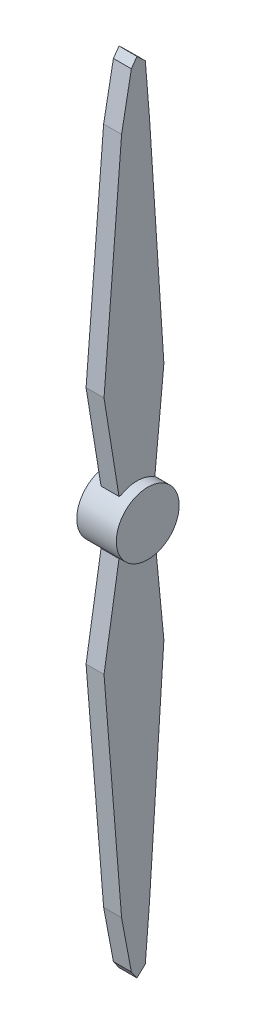
ISO-10303-21;
HEADER;
FILE_DESCRIPTION(('STEP AP214'),'2;1');
FILE_NAME('part.step','',(''),(''),'','','');
FILE_SCHEMA(('AUTOMOTIVE_DESIGN { 1 0 10303 214 1 1 1 1 }'));
ENDSEC;
DATA;
#1=APPLICATION_CONTEXT('core data for automotive mechanical design processes');
#2=APPLICATION_PROTOCOL_DEFINITION('international standard','automotive_design',2000,#1);
#3=PRODUCT_CONTEXT('',#1,'mechanical');
#4=PRODUCT('Part','Part','',(#3));
#5=PRODUCT_RELATED_PRODUCT_CATEGORY('part','',(#4));
#6=PRODUCT_DEFINITION_FORMATION('','',#4);
#7=PRODUCT_DEFINITION_CONTEXT('part definition',#1,'design');
#8=PRODUCT_DEFINITION('design','',#6,#7);
#9=PRODUCT_DEFINITION_SHAPE('','',#8);
#10=(LENGTH_UNIT() NAMED_UNIT(*) SI_UNIT(.MILLI.,.METRE.));
#11=(NAMED_UNIT(*) PLANE_ANGLE_UNIT() SI_UNIT($,.RADIAN.));
#12=(NAMED_UNIT(*) SI_UNIT($,.STERADIAN.) SOLID_ANGLE_UNIT());
#13=UNCERTAINTY_MEASURE_WITH_UNIT(LENGTH_MEASURE(1.E-05),#10,'distance_accuracy_value','');
#14=(GEOMETRIC_REPRESENTATION_CONTEXT(3) GLOBAL_UNCERTAINTY_ASSIGNED_CONTEXT((#13)) GLOBAL_UNIT_ASSIGNED_CONTEXT((#10,
#11,#12)) REPRESENTATION_CONTEXT('',''));
#15=CARTESIAN_POINT('',(0.,0.,0.));
#16=DIRECTION('',(0.,0.,1.));
#17=DIRECTION('',(1.,0.,0.));
#18=AXIS2_PLACEMENT_3D('',#15,#16,#17);
#19=CARTESIAN_POINT('',(8.8,0.,0.));
#20=DIRECTION('',(-1.,0.,0.));
#21=DIRECTION('',(0.,0.,1.));
#22=AXIS2_PLACEMENT_3D('',#19,#20,#21);
#23=CYLINDRICAL_SURFACE('',#22,14.);
#24=CARTESIAN_POINT('',(-8.8,0.,0.));
#25=DIRECTION('',(1.,0.,0.));
#26=DIRECTION('',(0.,0.,-1.));
#27=AXIS2_PLACEMENT_3D('',#24,#25,#26);
#28=CIRCLE('',#27,14.);
#29=CARTESIAN_POINT('',(-8.8,0.,-14.));
#30=VERTEX_POINT('',#29);
#31=EDGE_CURVE('E213',#30,#30,#28,.T.);
#32=ORIENTED_EDGE('',*,*,#31,.T.);
#33=EDGE_LOOP('',(#32));
#34=FACE_BOUND('',#33,.T.);
#35=CARTESIAN_POINT('',(8.8,0.,0.));
#36=DIRECTION('',(1.,0.,0.));
#37=DIRECTION('',(0.,0.,-1.));
#38=AXIS2_PLACEMENT_3D('',#35,#36,#37);
#39=CIRCLE('',#38,14.);
#40=CARTESIAN_POINT('',(8.8,0.,-14.));
#41=VERTEX_POINT('',#40);
#42=EDGE_CURVE('E216',#41,#41,#39,.T.);
#43=ORIENTED_EDGE('',*,*,#42,.F.);
#44=EDGE_LOOP('',(#43));
#45=FACE_BOUND('',#44,.T.);
#46=CARTESIAN_POINT('',(4.,0.,0.));
#47=DIRECTION('',(1.,0.,0.));
#48=DIRECTION('',(0.,0.,-1.));
#49=AXIS2_PLACEMENT_3D('',#46,#47,#48);
#50=CIRCLE('',#49,14.);
#51=CARTESIAN_POINT('',(4.,12.,7.21110255092798));
#52=VERTEX_POINT('',#51);
#53=CARTESIAN_POINT('',(4.,12.,-7.21110255092798));
#54=VERTEX_POINT('',#53);
#55=EDGE_CURVE('E62',#52,#54,#50,.F.);
#56=ORIENTED_EDGE('',*,*,#55,.F.);
#57=DIRECTION('',(-1.,0.,0.));
#58=VECTOR('',#57,1.);
#59=CARTESIAN_POINT('',(8.8,12.,7.21110255092798));
#60=LINE('',#59,#58);
#61=CARTESIAN_POINT('',(-4.,12.,7.21110255092798));
#62=VERTEX_POINT('',#61);
#63=EDGE_CURVE('E240',#52,#62,#60,.T.);
#64=ORIENTED_EDGE('',*,*,#63,.T.);
#65=CARTESIAN_POINT('',(-4.,0.,0.));
#66=DIRECTION('',(1.,0.,0.));
#67=DIRECTION('',(0.,0.,-1.));
#68=AXIS2_PLACEMENT_3D('',#65,#66,#67);
#69=CIRCLE('',#68,14.);
#70=CARTESIAN_POINT('',(-4.,12.,-7.21110255092798));
#71=VERTEX_POINT('',#70);
#72=EDGE_CURVE('E314',#62,#71,#69,.F.);
#73=ORIENTED_EDGE('',*,*,#72,.T.);
#74=DIRECTION('',(-1.,0.,0.));
#75=VECTOR('',#74,1.);
#76=CARTESIAN_POINT('',(8.8,12.,-7.21110255092798));
#77=LINE('',#76,#75);
#78=EDGE_CURVE('E244',#71,#54,#77,.F.);
#79=ORIENTED_EDGE('',*,*,#78,.T.);
#80=EDGE_LOOP('',(#56,#64,#73,#79));
#81=FACE_BOUND('',#80,.T.);
#82=CARTESIAN_POINT('',(4.,0.,0.));
#83=DIRECTION('',(-1.,0.,0.));
#84=DIRECTION('',(0.,0.,1.));
#85=AXIS2_PLACEMENT_3D('',#82,#83,#84);
#86=CIRCLE('',#85,14.);
#87=CARTESIAN_POINT('',(4.,-12.,-7.21110255092798));
#88=VERTEX_POINT('',#87);
#89=CARTESIAN_POINT('',(4.,-12.,7.21110255092798));
#90=VERTEX_POINT('',#89);
#91=EDGE_CURVE('E11',#88,#90,#86,.T.);
#92=ORIENTED_EDGE('',*,*,#91,.F.);
#93=DIRECTION('',(-1.,0.,0.));
#94=VECTOR('',#93,1.);
#95=CARTESIAN_POINT('',(8.8,-12.,-7.21110255092798));
#96=LINE('',#95,#94);
#97=CARTESIAN_POINT('',(-4.,-12.,-7.21110255092798));
#98=VERTEX_POINT('',#97);
#99=EDGE_CURVE('E318',#98,#88,#96,.F.);
#100=ORIENTED_EDGE('',*,*,#99,.F.);
#101=CARTESIAN_POINT('',(-4.,0.,0.));
#102=DIRECTION('',(-1.,0.,0.));
#103=DIRECTION('',(0.,0.,1.));
#104=AXIS2_PLACEMENT_3D('',#101,#102,#103);
#105=CIRCLE('',#104,14.);
#106=CARTESIAN_POINT('',(-4.,-12.,7.21110255092798));
#107=VERTEX_POINT('',#106);
#108=EDGE_CURVE('E212',#98,#107,#105,.T.);
#109=ORIENTED_EDGE('',*,*,#108,.T.);
#110=DIRECTION('',(-1.,0.,0.));
#111=VECTOR('',#110,1.);
#112=CARTESIAN_POINT('',(8.8,-12.,7.21110255092798));
#113=LINE('',#112,#111);
#114=EDGE_CURVE('E47',#90,#107,#113,.T.);
#115=ORIENTED_EDGE('',*,*,#114,.F.);
#116=EDGE_LOOP('',(#92,#100,#109,#115));
#117=FACE_BOUND('',#116,.T.);
#118=ADVANCED_FACE('F39',(#34,#45,#81,#117),#23,.T.);
#119=CARTESIAN_POINT('',(4.,12.,-8.001));
#120=DIRECTION('',(0.,1.,0.));
#121=DIRECTION('',(0.,0.,1.));
#122=AXIS2_PLACEMENT_3D('',#119,#120,#121);
#123=PLANE('',#122);
#124=ORIENTED_EDGE('',*,*,#78,.F.);
#125=DIRECTION('',(0.,0.,-1.));
#126=VECTOR('',#125,1.);
#127=CARTESIAN_POINT('',(-4.,12.,-8.001));
#128=LINE('',#127,#126);
#129=CARTESIAN_POINT('',(-4.,12.,-8.001));
#130=VERTEX_POINT('',#129);
#131=EDGE_CURVE('E248',#71,#130,#128,.T.);
#132=ORIENTED_EDGE('',*,*,#131,.T.);
#133=DIRECTION('',(-1.,0.,0.));
#134=VECTOR('',#133,1.);
#135=CARTESIAN_POINT('',(4.,12.,-8.001));
#136=LINE('',#135,#134);
#137=CARTESIAN_POINT('',(4.,12.,-8.001));
#138=VERTEX_POINT('',#137);
#139=EDGE_CURVE('E311',#138,#130,#136,.T.);
#140=ORIENTED_EDGE('',*,*,#139,.F.);
#141=DIRECTION('',(0.,0.,-1.));
#142=VECTOR('',#141,1.);
#143=CARTESIAN_POINT('',(4.,12.,-8.001));
#144=LINE('',#143,#142);
#145=EDGE_CURVE('E252',#54,#138,#144,.T.);
#146=ORIENTED_EDGE('',*,*,#145,.F.);
#147=EDGE_LOOP('',(#124,#132,#140,#146));
#148=FACE_BOUND('',#147,.T.);
#149=ADVANCED_FACE('F41',(#148),#123,.F.);
#150=ORIENTED_EDGE('',*,*,#63,.F.);
#151=CARTESIAN_POINT('',(4.,12.,8.001));
#152=VERTEX_POINT('',#151);
#153=EDGE_CURVE('E249',#152,#52,#144,.T.);
#154=ORIENTED_EDGE('',*,*,#153,.F.);
#155=DIRECTION('',(-1.,0.,0.));
#156=VECTOR('',#155,1.);
#157=CARTESIAN_POINT('',(4.,12.,8.001));
#158=LINE('',#157,#156);
#159=CARTESIAN_POINT('',(-4.,12.,8.001));
#160=VERTEX_POINT('',#159);
#161=EDGE_CURVE('E268',#152,#160,#158,.T.);
#162=ORIENTED_EDGE('',*,*,#161,.T.);
#163=EDGE_CURVE('E269',#160,#62,#128,.T.);
#164=ORIENTED_EDGE('',*,*,#163,.T.);
#165=EDGE_LOOP('',(#150,#154,#162,#164));
#166=FACE_BOUND('',#165,.T.);
#167=ADVANCED_FACE('F407',(#166),#123,.F.);
#168=CARTESIAN_POINT('',(4.,53.34,-12.0015));
#169=DIRECTION('',(0.,0.096320732214566,0.995350348643959));
#170=DIRECTION('',(0.,-0.995350348643959,0.096320732214566));
#171=AXIS2_PLACEMENT_3D('',#168,#169,#170);
#172=PLANE('',#171);
#173=DIRECTION('',(0.,0.995350348643959,-0.096320732214566));
#174=VECTOR('',#173,1.);
#175=CARTESIAN_POINT('',(-4.,53.34,-12.0015));
#176=LINE('',#175,#174);
#177=CARTESIAN_POINT('',(-4.,53.34,-12.0015));
#178=VERTEX_POINT('',#177);
#179=EDGE_CURVE('E272',#130,#178,#176,.T.);
#180=ORIENTED_EDGE('',*,*,#179,.T.);
#181=DIRECTION('',(-1.,0.,0.));
#182=VECTOR('',#181,1.);
#183=CARTESIAN_POINT('',(4.,53.34,-12.0015));
#184=LINE('',#183,#182);
#185=CARTESIAN_POINT('',(4.,53.34,-12.0015));
#186=VERTEX_POINT('',#185);
#187=EDGE_CURVE('E308',#186,#178,#184,.T.);
#188=ORIENTED_EDGE('',*,*,#187,.F.);
#189=DIRECTION('',(0.,0.995350348643959,-0.096320732214566));
#190=VECTOR('',#189,1.);
#191=CARTESIAN_POINT('',(4.,53.34,-12.0015));
#192=LINE('',#191,#190);
#193=EDGE_CURVE('E251',#138,#186,#192,.T.);
#194=ORIENTED_EDGE('',*,*,#193,.F.);
#195=ORIENTED_EDGE('',*,*,#139,.T.);
#196=EDGE_LOOP('',(#180,#188,#194,#195));
#197=FACE_BOUND('',#196,.T.);
#198=ADVANCED_FACE('F447',(#197),#172,.F.);
#199=CARTESIAN_POINT('',(4.,151.13,-5.6007));
#200=DIRECTION('',(0.,-0.0653147810154766,0.99786470995867));
#201=DIRECTION('',(0.,-0.99786470995867,-0.0653147810154766));
#202=AXIS2_PLACEMENT_3D('',#199,#200,#201);
#203=PLANE('',#202);
#204=DIRECTION('',(0.,0.99786470995867,0.0653147810154766));
#205=VECTOR('',#204,1.);
#206=CARTESIAN_POINT('',(-4.,151.13,-5.6007));
#207=LINE('',#206,#205);
#208=CARTESIAN_POINT('',(-4.,151.13,-5.6007));
#209=VERTEX_POINT('',#208);
#210=EDGE_CURVE('E274',#178,#209,#207,.T.);
#211=ORIENTED_EDGE('',*,*,#210,.T.);
#212=DIRECTION('',(-1.,0.,0.));
#213=VECTOR('',#212,1.);
#214=CARTESIAN_POINT('',(4.,151.13,-5.6007));
#215=LINE('',#214,#213);
#216=CARTESIAN_POINT('',(4.,151.13,-5.6007));
#217=VERTEX_POINT('',#216);
#218=EDGE_CURVE('E305',#217,#209,#215,.T.);
#219=ORIENTED_EDGE('',*,*,#218,.F.);
#220=DIRECTION('',(0.,0.99786470995867,0.0653147810154766));
#221=VECTOR('',#220,1.);
#222=CARTESIAN_POINT('',(4.,151.13,-5.6007));
#223=LINE('',#222,#221);
#224=EDGE_CURVE('E254',#186,#217,#223,.T.);
#225=ORIENTED_EDGE('',*,*,#224,.F.);
#226=ORIENTED_EDGE('',*,*,#187,.T.);
#227=EDGE_LOOP('',(#211,#219,#225,#226));
#228=FACE_BOUND('',#227,.T.);
#229=ADVANCED_FACE('F444',(#228),#203,.F.);
#230=CARTESIAN_POINT('',(4.,174.244,-3.7338));
#231=DIRECTION('',(0.,-0.0805070569764701,0.996754038756296));
#232=DIRECTION('',(0.,-0.996754038756296,-0.0805070569764701));
#233=AXIS2_PLACEMENT_3D('',#230,#231,#232);
#234=PLANE('',#233);
#235=DIRECTION('',(0.,0.996754038756296,0.0805070569764701));
#236=VECTOR('',#235,1.);
#237=CARTESIAN_POINT('',(-4.,174.244,-3.7338));
#238=LINE('',#237,#236);
#239=CARTESIAN_POINT('',(-4.,174.244,-3.7338));
#240=VERTEX_POINT('',#239);
#241=EDGE_CURVE('E276',#209,#240,#238,.T.);
#242=ORIENTED_EDGE('',*,*,#241,.T.);
#243=DIRECTION('',(-1.,0.,0.));
#244=VECTOR('',#243,1.);
#245=CARTESIAN_POINT('',(4.,174.244,-3.7338));
#246=LINE('',#245,#244);
#247=CARTESIAN_POINT('',(4.,174.244,-3.7338));
#248=VERTEX_POINT('',#247);
#249=EDGE_CURVE('E302',#248,#240,#246,.T.);
#250=ORIENTED_EDGE('',*,*,#249,.F.);
#251=DIRECTION('',(0.,0.996754038756296,0.0805070569764701));
#252=VECTOR('',#251,1.);
#253=CARTESIAN_POINT('',(4.,174.244,-3.7338));
#254=LINE('',#253,#252);
#255=EDGE_CURVE('E256',#217,#248,#254,.T.);
#256=ORIENTED_EDGE('',*,*,#255,.F.);
#257=ORIENTED_EDGE('',*,*,#218,.T.);
#258=EDGE_LOOP('',(#242,#250,#256,#257));
#259=FACE_BOUND('',#258,.T.);
#260=ADVANCED_FACE('F440',(#259),#234,.F.);
#261=CARTESIAN_POINT('',(4.,177.8,0.));
#262=DIRECTION('',(0.,-0.724137931034483,0.689655172413793));
#263=DIRECTION('',(0.,-0.689655172413793,-0.724137931034483));
#264=AXIS2_PLACEMENT_3D('',#261,#262,#263);
#265=PLANE('',#264);
#266=DIRECTION('',(0.,0.689655172413793,0.724137931034482));
#267=VECTOR('',#266,1.);
#268=CARTESIAN_POINT('',(-4.,177.8,0.));
#269=LINE('',#268,#267);
#270=CARTESIAN_POINT('',(-4.,177.8,0.));
#271=VERTEX_POINT('',#270);
#272=EDGE_CURVE('E278',#240,#271,#269,.T.);
#273=ORIENTED_EDGE('',*,*,#272,.T.);
#274=DIRECTION('',(-1.,0.,0.));
#275=VECTOR('',#274,1.);
#276=CARTESIAN_POINT('',(4.,177.8,0.));
#277=LINE('',#276,#275);
#278=CARTESIAN_POINT('',(4.,177.8,0.));
#279=VERTEX_POINT('',#278);
#280=EDGE_CURVE('E299',#279,#271,#277,.T.);
#281=ORIENTED_EDGE('',*,*,#280,.F.);
#282=DIRECTION('',(0.,0.689655172413793,0.724137931034482));
#283=VECTOR('',#282,1.);
#284=CARTESIAN_POINT('',(4.,177.8,0.));
#285=LINE('',#284,#283);
#286=EDGE_CURVE('E258',#248,#279,#285,.T.);
#287=ORIENTED_EDGE('',*,*,#286,.F.);
#288=ORIENTED_EDGE('',*,*,#249,.T.);
#289=EDGE_LOOP('',(#273,#281,#287,#288));
#290=FACE_BOUND('',#289,.T.);
#291=ADVANCED_FACE('F436',(#290),#265,.F.);
#292=CARTESIAN_POINT('',(4.,174.244,2.4892));
#293=DIRECTION('',(0.,-0.573462344363328,-0.819231920519041));
#294=DIRECTION('',(0.,0.819231920519041,-0.573462344363328));
#295=AXIS2_PLACEMENT_3D('',#292,#293,#294);
#296=PLANE('',#295);
#297=DIRECTION('',(0.,-0.819231920519041,0.573462344363328));
#298=VECTOR('',#297,1.);
#299=CARTESIAN_POINT('',(-4.,174.244,2.4892));
#300=LINE('',#299,#298);
#301=CARTESIAN_POINT('',(-4.,174.244,2.4892));
#302=VERTEX_POINT('',#301);
#303=EDGE_CURVE('E280',#271,#302,#300,.T.);
#304=ORIENTED_EDGE('',*,*,#303,.T.);
#305=DIRECTION('',(-1.,0.,0.));
#306=VECTOR('',#305,1.);
#307=CARTESIAN_POINT('',(4.,174.244,2.4892));
#308=LINE('',#307,#306);
#309=CARTESIAN_POINT('',(4.,174.244,2.4892));
#310=VERTEX_POINT('',#309);
#311=EDGE_CURVE('E296',#310,#302,#308,.T.);
#312=ORIENTED_EDGE('',*,*,#311,.F.);
#313=DIRECTION('',(0.,-0.819231920519041,0.573462344363328));
#314=VECTOR('',#313,1.);
#315=CARTESIAN_POINT('',(4.,174.244,2.4892));
#316=LINE('',#315,#314);
#317=EDGE_CURVE('E260',#279,#310,#316,.T.);
#318=ORIENTED_EDGE('',*,*,#317,.F.);
#319=ORIENTED_EDGE('',*,*,#280,.T.);
#320=EDGE_LOOP('',(#304,#312,#318,#319));
#321=FACE_BOUND('',#320,.T.);
#322=ADVANCED_FACE('F432',(#321),#296,.F.);
#323=CARTESIAN_POINT('',(4.,151.13,6.8453));
#324=DIRECTION('',(0.,-0.185201268913039,-0.982700610558984));
#325=DIRECTION('',(0.,0.982700610558984,-0.185201268913039));
#326=AXIS2_PLACEMENT_3D('',#323,#324,#325);
#327=PLANE('',#326);
#328=DIRECTION('',(0.,-0.982700610558984,0.185201268913039));
#329=VECTOR('',#328,1.);
#330=CARTESIAN_POINT('',(-4.,151.13,6.8453));
#331=LINE('',#330,#329);
#332=CARTESIAN_POINT('',(-4.,151.13,6.8453));
#333=VERTEX_POINT('',#332);
#334=EDGE_CURVE('E282',#302,#333,#331,.T.);
#335=ORIENTED_EDGE('',*,*,#334,.T.);
#336=DIRECTION('',(-1.,0.,0.));
#337=VECTOR('',#336,1.);
#338=CARTESIAN_POINT('',(4.,151.13,6.8453));
#339=LINE('',#338,#337);
#340=CARTESIAN_POINT('',(4.,151.13,6.8453));
#341=VERTEX_POINT('',#340);
#342=EDGE_CURVE('E293',#341,#333,#339,.T.);
#343=ORIENTED_EDGE('',*,*,#342,.F.);
#344=DIRECTION('',(0.,-0.982700610558984,0.185201268913039));
#345=VECTOR('',#344,1.);
#346=CARTESIAN_POINT('',(4.,151.13,6.8453));
#347=LINE('',#346,#345);
#348=EDGE_CURVE('E262',#310,#341,#347,.T.);
#349=ORIENTED_EDGE('',*,*,#348,.F.);
#350=ORIENTED_EDGE('',*,*,#311,.T.);
#351=EDGE_LOOP('',(#335,#343,#349,#350));
#352=FACE_BOUND('',#351,.T.);
#353=ADVANCED_FACE('F428',(#352),#327,.F.);
#354=CARTESIAN_POINT('',(4.,53.34,14.6685));
#355=DIRECTION('',(0.,-0.07974522228289,-0.996815278536125));
#356=DIRECTION('',(0.,0.996815278536125,-0.07974522228289));
#357=AXIS2_PLACEMENT_3D('',#354,#355,#356);
#358=PLANE('',#357);
#359=DIRECTION('',(0.,-0.996815278536125,0.07974522228289));
#360=VECTOR('',#359,1.);
#361=CARTESIAN_POINT('',(-4.,53.34,14.6685));
#362=LINE('',#361,#360);
#363=CARTESIAN_POINT('',(-4.,53.34,14.6685));
#364=VERTEX_POINT('',#363);
#365=EDGE_CURVE('E284',#333,#364,#362,.T.);
#366=ORIENTED_EDGE('',*,*,#365,.T.);
#367=DIRECTION('',(-1.,0.,0.));
#368=VECTOR('',#367,1.);
#369=CARTESIAN_POINT('',(4.,53.34,14.6685));
#370=LINE('',#369,#368);
#371=CARTESIAN_POINT('',(4.,53.34,14.6685));
#372=VERTEX_POINT('',#371);
#373=EDGE_CURVE('E290',#372,#364,#370,.T.);
#374=ORIENTED_EDGE('',*,*,#373,.F.);
#375=DIRECTION('',(0.,-0.996815278536125,0.07974522228289));
#376=VECTOR('',#375,1.);
#377=CARTESIAN_POINT('',(4.,53.34,14.6685));
#378=LINE('',#377,#376);
#379=EDGE_CURVE('E264',#341,#372,#378,.T.);
#380=ORIENTED_EDGE('',*,*,#379,.F.);
#381=ORIENTED_EDGE('',*,*,#342,.T.);
#382=EDGE_LOOP('',(#366,#374,#380,#381));
#383=FACE_BOUND('',#382,.T.);
#384=ADVANCED_FACE('F424',(#383),#358,.F.);
#385=CARTESIAN_POINT('',(4.,12.,8.001));
#386=DIRECTION('',(0.,0.159226807644673,-0.987242028951));
#387=DIRECTION('',(0.,0.987242028951,0.159226807644673));
#388=AXIS2_PLACEMENT_3D('',#385,#386,#387);
#389=PLANE('',#388);
#390=DIRECTION('',(0.,-0.987242028951,-0.159226807644673));
#391=VECTOR('',#390,1.);
#392=CARTESIAN_POINT('',(-4.,12.,8.001));
#393=LINE('',#392,#391);
#394=EDGE_CURVE('E286',#364,#160,#393,.T.);
#395=ORIENTED_EDGE('',*,*,#394,.T.);
#396=ORIENTED_EDGE('',*,*,#161,.F.);
#397=DIRECTION('',(0.,-0.987242028951,-0.159226807644673));
#398=VECTOR('',#397,1.);
#399=CARTESIAN_POINT('',(4.,12.,8.001));
#400=LINE('',#399,#398);
#401=EDGE_CURVE('E266',#372,#152,#400,.T.);
#402=ORIENTED_EDGE('',*,*,#401,.F.);
#403=ORIENTED_EDGE('',*,*,#373,.T.);
#404=EDGE_LOOP('',(#395,#396,#402,#403));
#405=FACE_BOUND('',#404,.T.);
#406=ADVANCED_FACE('F418',(#405),#389,.F.);
#407=CARTESIAN_POINT('',(4.,0.,0.));
#408=DIRECTION('',(1.,0.,0.));
#409=DIRECTION('',(0.,0.,-1.));
#410=AXIS2_PLACEMENT_3D('',#407,#408,#409);
#411=PLANE('',#410);
#412=ORIENTED_EDGE('',*,*,#153,.T.);
#413=ORIENTED_EDGE('',*,*,#55,.T.);
#414=ORIENTED_EDGE('',*,*,#145,.T.);
#415=ORIENTED_EDGE('',*,*,#193,.T.);
#416=ORIENTED_EDGE('',*,*,#224,.T.);
#417=ORIENTED_EDGE('',*,*,#255,.T.);
#418=ORIENTED_EDGE('',*,*,#286,.T.);
#419=ORIENTED_EDGE('',*,*,#317,.T.);
#420=ORIENTED_EDGE('',*,*,#348,.T.);
#421=ORIENTED_EDGE('',*,*,#379,.T.);
#422=ORIENTED_EDGE('',*,*,#401,.T.);
#423=EDGE_LOOP('',(#412,#413,#414,#415,#416,#417,#418,#419,#420,#421,#422));
#424=FACE_BOUND('',#423,.T.);
#425=ADVANCED_FACE('F414',(#424),#411,.T.);
#426=CARTESIAN_POINT('',(-4.,0.,0.));
#427=DIRECTION('',(1.,0.,0.));
#428=DIRECTION('',(0.,0.,-1.));
#429=AXIS2_PLACEMENT_3D('',#426,#427,#428);
#430=PLANE('',#429);
#431=ORIENTED_EDGE('',*,*,#72,.F.);
#432=ORIENTED_EDGE('',*,*,#163,.F.);
#433=ORIENTED_EDGE('',*,*,#394,.F.);
#434=ORIENTED_EDGE('',*,*,#365,.F.);
#435=ORIENTED_EDGE('',*,*,#334,.F.);
#436=ORIENTED_EDGE('',*,*,#303,.F.);
#437=ORIENTED_EDGE('',*,*,#272,.F.);
#438=ORIENTED_EDGE('',*,*,#241,.F.);
#439=ORIENTED_EDGE('',*,*,#210,.F.);
#440=ORIENTED_EDGE('',*,*,#179,.F.);
#441=ORIENTED_EDGE('',*,*,#131,.F.);
#442=EDGE_LOOP('',(#431,#432,#433,#434,#435,#436,#437,#438,#439,#440,#441));
#443=FACE_BOUND('',#442,.T.);
#444=ADVANCED_FACE('F417',(#443),#430,.F.);
#445=CARTESIAN_POINT('',(8.8,0.,0.));
#446=DIRECTION('',(1.,0.,0.));
#447=DIRECTION('',(0.,0.,-1.));
#448=AXIS2_PLACEMENT_3D('',#445,#446,#447);
#449=PLANE('',#448);
#450=ORIENTED_EDGE('',*,*,#42,.T.);
#451=EDGE_LOOP('',(#450));
#452=FACE_BOUND('',#451,.T.);
#453=ADVANCED_FACE('F421',(#452),#449,.T.);
#454=CARTESIAN_POINT('',(-8.8,0.,0.));
#455=DIRECTION('',(1.,0.,0.));
#456=DIRECTION('',(0.,0.,-1.));
#457=AXIS2_PLACEMENT_3D('',#454,#455,#456);
#458=PLANE('',#457);
#459=ORIENTED_EDGE('',*,*,#31,.F.);
#460=EDGE_LOOP('',(#459));
#461=FACE_BOUND('',#460,.T.);
#462=ADVANCED_FACE('F412',(#461),#458,.F.);
#463=CARTESIAN_POINT('',(4.,-12.,-8.001));
#464=DIRECTION('',(0.,-1.,0.));
#465=DIRECTION('',(0.,0.,-1.));
#466=AXIS2_PLACEMENT_3D('',#463,#464,#465);
#467=PLANE('',#466);
#468=DIRECTION('',(0.,0.,1.));
#469=VECTOR('',#468,1.);
#470=CARTESIAN_POINT('',(4.,-12.,-8.001));
#471=LINE('',#470,#469);
#472=CARTESIAN_POINT('',(4.,-12.,8.001));
#473=VERTEX_POINT('',#472);
#474=EDGE_CURVE('E237',#90,#473,#471,.T.);
#475=ORIENTED_EDGE('',*,*,#474,.F.);
#476=ORIENTED_EDGE('',*,*,#114,.T.);
#477=DIRECTION('',(0.,0.,1.));
#478=VECTOR('',#477,1.);
#479=CARTESIAN_POINT('',(-4.,-12.,-8.001));
#480=LINE('',#479,#478);
#481=CARTESIAN_POINT('',(-4.,-12.,8.001));
#482=VERTEX_POINT('',#481);
#483=EDGE_CURVE('E54',#107,#482,#480,.T.);
#484=ORIENTED_EDGE('',*,*,#483,.T.);
#485=DIRECTION('',(-1.,0.,0.));
#486=VECTOR('',#485,1.);
#487=CARTESIAN_POINT('',(4.,-12.,8.001));
#488=LINE('',#487,#486);
#489=EDGE_CURVE('E361',#473,#482,#488,.T.);
#490=ORIENTED_EDGE('',*,*,#489,.F.);
#491=EDGE_LOOP('',(#475,#476,#484,#490));
#492=FACE_BOUND('',#491,.T.);
#493=ADVANCED_FACE('F322',(#492),#467,.F.);
#494=CARTESIAN_POINT('',(-4.,-12.,-8.001));
#495=VERTEX_POINT('',#494);
#496=EDGE_CURVE('E205',#495,#98,#480,.T.);
#497=ORIENTED_EDGE('',*,*,#496,.T.);
#498=ORIENTED_EDGE('',*,*,#99,.T.);
#499=CARTESIAN_POINT('',(4.,-12.,-8.001));
#500=VERTEX_POINT('',#499);
#501=EDGE_CURVE('E200',#500,#88,#471,.T.);
#502=ORIENTED_EDGE('',*,*,#501,.F.);
#503=DIRECTION('',(-1.,0.,0.));
#504=VECTOR('',#503,1.);
#505=CARTESIAN_POINT('',(4.,-12.,-8.001));
#506=LINE('',#505,#504);
#507=EDGE_CURVE('E193',#500,#495,#506,.T.);
#508=ORIENTED_EDGE('',*,*,#507,.T.);
#509=EDGE_LOOP('',(#497,#498,#502,#508));
#510=FACE_BOUND('',#509,.T.);
#511=ADVANCED_FACE('F204',(#510),#467,.F.);
#512=CARTESIAN_POINT('',(4.,-12.,8.001));
#513=DIRECTION('',(0.,-0.159226807644673,-0.987242028951));
#514=DIRECTION('',(0.,0.987242028951,-0.159226807644673));
#515=AXIS2_PLACEMENT_3D('',#512,#513,#514);
#516=PLANE('',#515);
#517=DIRECTION('',(0.,-0.987242028951,0.159226807644673));
#518=VECTOR('',#517,1.);
#519=CARTESIAN_POINT('',(-4.,-12.,8.001));
#520=LINE('',#519,#518);
#521=CARTESIAN_POINT('',(-4.,-53.34,14.6685));
#522=VERTEX_POINT('',#521);
#523=EDGE_CURVE('E218',#482,#522,#520,.T.);
#524=ORIENTED_EDGE('',*,*,#523,.T.);
#525=DIRECTION('',(-1.,0.,0.));
#526=VECTOR('',#525,1.);
#527=CARTESIAN_POINT('',(4.,-53.34,14.6685));
#528=LINE('',#527,#526);
#529=CARTESIAN_POINT('',(4.,-53.34,14.6685));
#530=VERTEX_POINT('',#529);
#531=EDGE_CURVE('E359',#530,#522,#528,.T.);
#532=ORIENTED_EDGE('',*,*,#531,.F.);
#533=DIRECTION('',(0.,-0.987242028951,0.159226807644673));
#534=VECTOR('',#533,1.);
#535=CARTESIAN_POINT('',(4.,-12.,8.001));
#536=LINE('',#535,#534);
#537=EDGE_CURVE('E235',#473,#530,#536,.T.);
#538=ORIENTED_EDGE('',*,*,#537,.F.);
#539=ORIENTED_EDGE('',*,*,#489,.T.);
#540=EDGE_LOOP('',(#524,#532,#538,#539));
#541=FACE_BOUND('',#540,.T.);
#542=ADVANCED_FACE('F357',(#541),#516,.F.);
#543=CARTESIAN_POINT('',(4.,-53.34,14.6685));
#544=DIRECTION('',(0.,0.07974522228289,-0.996815278536125));
#545=DIRECTION('',(0.,0.996815278536125,0.07974522228289));
#546=AXIS2_PLACEMENT_3D('',#543,#544,#545);
#547=PLANE('',#546);
#548=DIRECTION('',(0.,-0.996815278536125,-0.07974522228289));
#549=VECTOR('',#548,1.);
#550=CARTESIAN_POINT('',(-4.,-53.34,14.6685));
#551=LINE('',#550,#549);
#552=CARTESIAN_POINT('',(-4.,-151.13,6.8453));
#553=VERTEX_POINT('',#552);
#554=EDGE_CURVE('E348',#522,#553,#551,.T.);
#555=ORIENTED_EDGE('',*,*,#554,.T.);
#556=DIRECTION('',(-1.,0.,0.));
#557=VECTOR('',#556,1.);
#558=CARTESIAN_POINT('',(4.,-151.13,6.8453));
#559=LINE('',#558,#557);
#560=CARTESIAN_POINT('',(4.,-151.13,6.8453));
#561=VERTEX_POINT('',#560);
#562=EDGE_CURVE('E363',#561,#553,#559,.T.);
#563=ORIENTED_EDGE('',*,*,#562,.F.);
#564=DIRECTION('',(0.,-0.996815278536125,-0.07974522228289));
#565=VECTOR('',#564,1.);
#566=CARTESIAN_POINT('',(4.,-53.34,14.6685));
#567=LINE('',#566,#565);
#568=EDGE_CURVE('E233',#530,#561,#567,.T.);
#569=ORIENTED_EDGE('',*,*,#568,.F.);
#570=ORIENTED_EDGE('',*,*,#531,.T.);
#571=EDGE_LOOP('',(#555,#563,#569,#570));
#572=FACE_BOUND('',#571,.T.);
#573=ADVANCED_FACE('F362',(#572),#547,.F.);
#574=CARTESIAN_POINT('',(4.,-151.13,6.8453));
#575=DIRECTION('',(0.,0.185201268913039,-0.982700610558984));
#576=DIRECTION('',(0.,0.982700610558984,0.185201268913039));
#577=AXIS2_PLACEMENT_3D('',#574,#575,#576);
#578=PLANE('',#577);
#579=DIRECTION('',(0.,-0.982700610558984,-0.185201268913039));
#580=VECTOR('',#579,1.);
#581=CARTESIAN_POINT('',(-4.,-151.13,6.8453));
#582=LINE('',#581,#580);
#583=CARTESIAN_POINT('',(-4.,-174.244,2.4892));
#584=VERTEX_POINT('',#583);
#585=EDGE_CURVE('E347',#553,#584,#582,.T.);
#586=ORIENTED_EDGE('',*,*,#585,.T.);
#587=DIRECTION('',(-1.,0.,0.));
#588=VECTOR('',#587,1.);
#589=CARTESIAN_POINT('',(4.,-174.244,2.4892));
#590=LINE('',#589,#588);
#591=CARTESIAN_POINT('',(4.,-174.244,2.4892));
#592=VERTEX_POINT('',#591);
#593=EDGE_CURVE('E373',#592,#584,#590,.T.);
#594=ORIENTED_EDGE('',*,*,#593,.F.);
#595=DIRECTION('',(0.,-0.982700610558984,-0.185201268913039));
#596=VECTOR('',#595,1.);
#597=CARTESIAN_POINT('',(4.,-151.13,6.8453));
#598=LINE('',#597,#596);
#599=EDGE_CURVE('E231',#561,#592,#598,.T.);
#600=ORIENTED_EDGE('',*,*,#599,.F.);
#601=ORIENTED_EDGE('',*,*,#562,.T.);
#602=EDGE_LOOP('',(#586,#594,#600,#601));
#603=FACE_BOUND('',#602,.T.);
#604=ADVANCED_FACE('F371',(#603),#578,.F.);
#605=CARTESIAN_POINT('',(4.,-174.244,2.4892));
#606=DIRECTION('',(0.,0.573462344363328,-0.819231920519041));
#607=DIRECTION('',(0.,0.819231920519041,0.573462344363328));
#608=AXIS2_PLACEMENT_3D('',#605,#606,#607);
#609=PLANE('',#608);
#610=DIRECTION('',(0.,-0.819231920519041,-0.573462344363328));
#611=VECTOR('',#610,1.);
#612=CARTESIAN_POINT('',(-4.,-174.244,2.4892));
#613=LINE('',#612,#611);
#614=CARTESIAN_POINT('',(-4.,-177.8,0.));
#615=VERTEX_POINT('',#614);
#616=EDGE_CURVE('E345',#584,#615,#613,.T.);
#617=ORIENTED_EDGE('',*,*,#616,.T.);
#618=DIRECTION('',(-1.,0.,0.));
#619=VECTOR('',#618,1.);
#620=CARTESIAN_POINT('',(4.,-177.8,0.));
#621=LINE('',#620,#619);
#622=CARTESIAN_POINT('',(4.,-177.8,0.));
#623=VERTEX_POINT('',#622);
#624=EDGE_CURVE('E379',#623,#615,#621,.T.);
#625=ORIENTED_EDGE('',*,*,#624,.F.);
#626=DIRECTION('',(0.,-0.819231920519041,-0.573462344363328));
#627=VECTOR('',#626,1.);
#628=CARTESIAN_POINT('',(4.,-174.244,2.4892));
#629=LINE('',#628,#627);
#630=EDGE_CURVE('E229',#592,#623,#629,.T.);
#631=ORIENTED_EDGE('',*,*,#630,.F.);
#632=ORIENTED_EDGE('',*,*,#593,.T.);
#633=EDGE_LOOP('',(#617,#625,#631,#632));
#634=FACE_BOUND('',#633,.T.);
#635=ADVANCED_FACE('F376',(#634),#609,.F.);
#636=CARTESIAN_POINT('',(4.,-177.8,0.));
#637=DIRECTION('',(0.,0.724137931034483,0.689655172413793));
#638=DIRECTION('',(0.,-0.689655172413793,0.724137931034483));
#639=AXIS2_PLACEMENT_3D('',#636,#637,#638);
#640=PLANE('',#639);
#641=DIRECTION('',(0.,0.689655172413793,-0.724137931034482));
#642=VECTOR('',#641,1.);
#643=CARTESIAN_POINT('',(-4.,-177.8,0.));
#644=LINE('',#643,#642);
#645=CARTESIAN_POINT('',(-4.,-174.244,-3.7338));
#646=VERTEX_POINT('',#645);
#647=EDGE_CURVE('E343',#615,#646,#644,.T.);
#648=ORIENTED_EDGE('',*,*,#647,.T.);
#649=DIRECTION('',(-1.,0.,0.));
#650=VECTOR('',#649,1.);
#651=CARTESIAN_POINT('',(4.,-174.244,-3.7338));
#652=LINE('',#651,#650);
#653=CARTESIAN_POINT('',(4.,-174.244,-3.7338));
#654=VERTEX_POINT('',#653);
#655=EDGE_CURVE('E336',#654,#646,#652,.T.);
#656=ORIENTED_EDGE('',*,*,#655,.F.);
#657=DIRECTION('',(0.,0.689655172413793,-0.724137931034482));
#658=VECTOR('',#657,1.);
#659=CARTESIAN_POINT('',(4.,-177.8,0.));
#660=LINE('',#659,#658);
#661=EDGE_CURVE('E227',#623,#654,#660,.T.);
#662=ORIENTED_EDGE('',*,*,#661,.F.);
#663=ORIENTED_EDGE('',*,*,#624,.T.);
#664=EDGE_LOOP('',(#648,#656,#662,#663));
#665=FACE_BOUND('',#664,.T.);
#666=ADVANCED_FACE('F390',(#665),#640,.F.);
#667=CARTESIAN_POINT('',(4.,-174.244,-3.7338));
#668=DIRECTION('',(0.,0.0805070569764701,0.996754038756296));
#669=DIRECTION('',(0.,-0.996754038756296,0.0805070569764701));
#670=AXIS2_PLACEMENT_3D('',#667,#668,#669);
#671=PLANE('',#670);
#672=DIRECTION('',(0.,0.996754038756296,-0.0805070569764701));
#673=VECTOR('',#672,1.);
#674=CARTESIAN_POINT('',(-4.,-174.244,-3.7338));
#675=LINE('',#674,#673);
#676=CARTESIAN_POINT('',(-4.,-151.13,-5.6007));
#677=VERTEX_POINT('',#676);
#678=EDGE_CURVE('E341',#646,#677,#675,.T.);
#679=ORIENTED_EDGE('',*,*,#678,.T.);
#680=DIRECTION('',(-1.,0.,0.));
#681=VECTOR('',#680,1.);
#682=CARTESIAN_POINT('',(4.,-151.13,-5.6007));
#683=LINE('',#682,#681);
#684=CARTESIAN_POINT('',(4.,-151.13,-5.6007));
#685=VERTEX_POINT('',#684);
#686=EDGE_CURVE('E334',#685,#677,#683,.T.);
#687=ORIENTED_EDGE('',*,*,#686,.F.);
#688=DIRECTION('',(0.,0.996754038756296,-0.0805070569764701));
#689=VECTOR('',#688,1.);
#690=CARTESIAN_POINT('',(4.,-174.244,-3.7338));
#691=LINE('',#690,#689);
#692=EDGE_CURVE('E225',#654,#685,#691,.T.);
#693=ORIENTED_EDGE('',*,*,#692,.F.);
#694=ORIENTED_EDGE('',*,*,#655,.T.);
#695=EDGE_LOOP('',(#679,#687,#693,#694));
#696=FACE_BOUND('',#695,.T.);
#697=ADVANCED_FACE('F387',(#696),#671,.F.);
#698=CARTESIAN_POINT('',(4.,-151.13,-5.6007));
#699=DIRECTION('',(0.,0.0653147810154766,0.99786470995867));
#700=DIRECTION('',(0.,-0.99786470995867,0.0653147810154766));
#701=AXIS2_PLACEMENT_3D('',#698,#699,#700);
#702=PLANE('',#701);
#703=DIRECTION('',(0.,0.99786470995867,-0.0653147810154766));
#704=VECTOR('',#703,1.);
#705=CARTESIAN_POINT('',(-4.,-151.13,-5.6007));
#706=LINE('',#705,#704);
#707=CARTESIAN_POINT('',(-4.,-53.34,-12.0015));
#708=VERTEX_POINT('',#707);
#709=EDGE_CURVE('E199',#677,#708,#706,.T.);
#710=ORIENTED_EDGE('',*,*,#709,.T.);
#711=DIRECTION('',(-1.,0.,0.));
#712=VECTOR('',#711,1.);
#713=CARTESIAN_POINT('',(4.,-53.34,-12.0015));
#714=LINE('',#713,#712);
#715=CARTESIAN_POINT('',(4.,-53.34,-12.0015));
#716=VERTEX_POINT('',#715);
#717=EDGE_CURVE('E196',#716,#708,#714,.T.);
#718=ORIENTED_EDGE('',*,*,#717,.F.);
#719=DIRECTION('',(0.,0.99786470995867,-0.0653147810154766));
#720=VECTOR('',#719,1.);
#721=CARTESIAN_POINT('',(4.,-151.13,-5.6007));
#722=LINE('',#721,#720);
#723=EDGE_CURVE('E223',#685,#716,#722,.T.);
#724=ORIENTED_EDGE('',*,*,#723,.F.);
#725=ORIENTED_EDGE('',*,*,#686,.T.);
#726=EDGE_LOOP('',(#710,#718,#724,#725));
#727=FACE_BOUND('',#726,.T.);
#728=ADVANCED_FACE('F333',(#727),#702,.F.);
#729=CARTESIAN_POINT('',(4.,-53.34,-12.0015));
#730=DIRECTION('',(0.,-0.096320732214566,0.995350348643959));
#731=DIRECTION('',(0.,-0.995350348643959,-0.096320732214566));
#732=AXIS2_PLACEMENT_3D('',#729,#730,#731);
#733=PLANE('',#732);
#734=DIRECTION('',(0.,0.995350348643959,0.096320732214566));
#735=VECTOR('',#734,1.);
#736=CARTESIAN_POINT('',(-4.,-53.34,-12.0015));
#737=LINE('',#736,#735);
#738=EDGE_CURVE('E189',#708,#495,#737,.T.);
#739=ORIENTED_EDGE('',*,*,#738,.T.);
#740=ORIENTED_EDGE('',*,*,#507,.F.);
#741=DIRECTION('',(0.,0.995350348643959,0.096320732214566));
#742=VECTOR('',#741,1.);
#743=CARTESIAN_POINT('',(4.,-53.34,-12.0015));
#744=LINE('',#743,#742);
#745=EDGE_CURVE('E208',#716,#500,#744,.T.);
#746=ORIENTED_EDGE('',*,*,#745,.F.);
#747=ORIENTED_EDGE('',*,*,#717,.T.);
#748=EDGE_LOOP('',(#739,#740,#746,#747));
#749=FACE_BOUND('',#748,.T.);
#750=ADVANCED_FACE('F191',(#749),#733,.F.);
#751=CARTESIAN_POINT('',(4.,0.,0.));
#752=DIRECTION('',(-1.,0.,0.));
#753=DIRECTION('',(0.,0.,1.));
#754=AXIS2_PLACEMENT_3D('',#751,#752,#753);
#755=PLANE('',#754);
#756=ORIENTED_EDGE('',*,*,#501,.T.);
#757=ORIENTED_EDGE('',*,*,#91,.T.);
#758=ORIENTED_EDGE('',*,*,#474,.T.);
#759=ORIENTED_EDGE('',*,*,#537,.T.);
#760=ORIENTED_EDGE('',*,*,#568,.T.);
#761=ORIENTED_EDGE('',*,*,#599,.T.);
#762=ORIENTED_EDGE('',*,*,#630,.T.);
#763=ORIENTED_EDGE('',*,*,#661,.T.);
#764=ORIENTED_EDGE('',*,*,#692,.T.);
#765=ORIENTED_EDGE('',*,*,#723,.T.);
#766=ORIENTED_EDGE('',*,*,#745,.T.);
#767=EDGE_LOOP('',(#756,#757,#758,#759,#760,#761,#762,#763,#764,#765,#766));
#768=FACE_BOUND('',#767,.T.);
#769=ADVANCED_FACE('F327',(#768),#755,.F.);
#770=CARTESIAN_POINT('',(-4.,0.,0.));
#771=DIRECTION('',(-1.,0.,0.));
#772=DIRECTION('',(0.,0.,1.));
#773=AXIS2_PLACEMENT_3D('',#770,#771,#772);
#774=PLANE('',#773);
#775=ORIENTED_EDGE('',*,*,#108,.F.);
#776=ORIENTED_EDGE('',*,*,#496,.F.);
#777=ORIENTED_EDGE('',*,*,#738,.F.);
#778=ORIENTED_EDGE('',*,*,#709,.F.);
#779=ORIENTED_EDGE('',*,*,#678,.F.);
#780=ORIENTED_EDGE('',*,*,#647,.F.);
#781=ORIENTED_EDGE('',*,*,#616,.F.);
#782=ORIENTED_EDGE('',*,*,#585,.F.);
#783=ORIENTED_EDGE('',*,*,#554,.F.);
#784=ORIENTED_EDGE('',*,*,#523,.F.);
#785=ORIENTED_EDGE('',*,*,#483,.F.);
#786=EDGE_LOOP('',(#775,#776,#777,#778,#779,#780,#781,#782,#783,#784,#785));
#787=FACE_BOUND('',#786,.T.);
#788=ADVANCED_FACE('F210',(#787),#774,.T.);
#789=CLOSED_SHELL('',(#118,#149,#167,#198,#229,#260,#291,#322,#353,#384,#406,#425,#444,#453,
#462,#493,#511,#542,#573,#604,#635,#666,#697,#728,#750,#769,#788));
#790=MANIFOLD_SOLID_BREP('B2',#789);
#791=ADVANCED_BREP_SHAPE_REPRESENTATION('',(#18,#790),#14);
#792=SHAPE_DEFINITION_REPRESENTATION(#9,#791);
ENDSEC;
END-ISO-10303-21;
